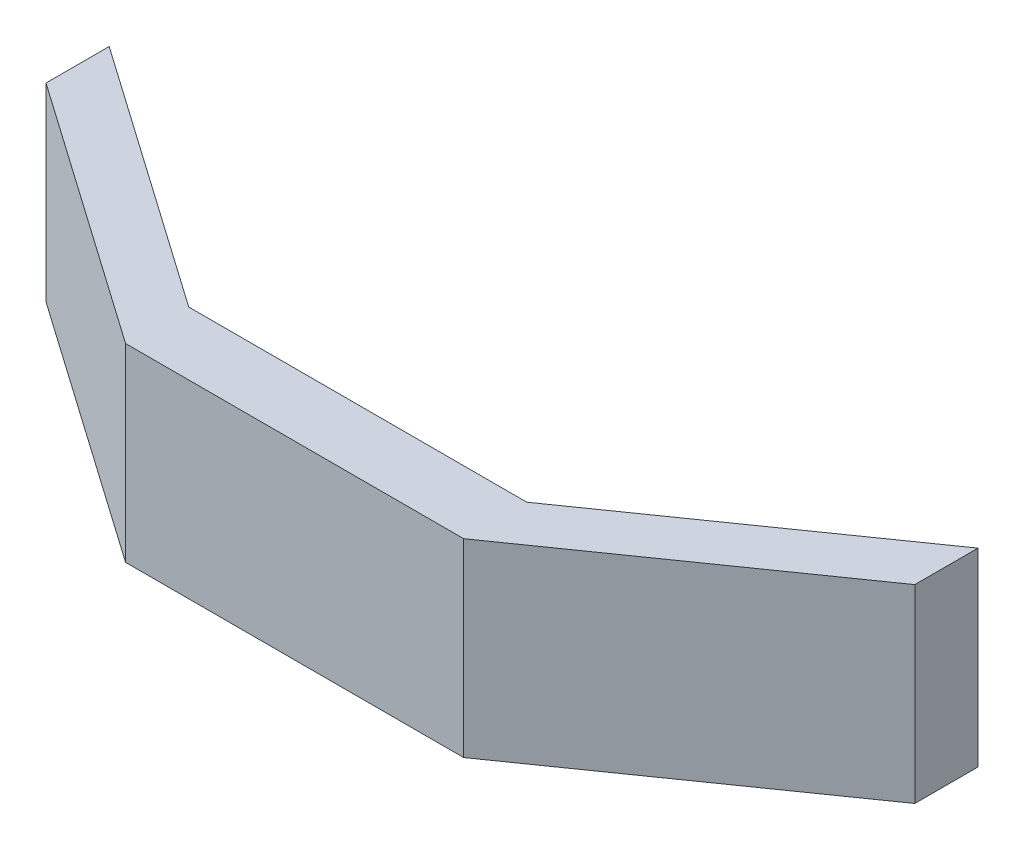
ISO-10303-21;
HEADER;
FILE_DESCRIPTION(('STEP AP214'),'2;1');
FILE_NAME('part.step','',(''),(''),'','','');
FILE_SCHEMA(('AUTOMOTIVE_DESIGN { 1 0 10303 214 1 1 1 1 }'));
ENDSEC;
DATA;
#1=APPLICATION_CONTEXT('core data for automotive mechanical design processes');
#2=APPLICATION_PROTOCOL_DEFINITION('international standard','automotive_design',2000,#1);
#3=PRODUCT_CONTEXT('',#1,'mechanical');
#4=PRODUCT('Part','Part','',(#3));
#5=PRODUCT_RELATED_PRODUCT_CATEGORY('part','',(#4));
#6=PRODUCT_DEFINITION_FORMATION('','',#4);
#7=PRODUCT_DEFINITION_CONTEXT('part definition',#1,'design');
#8=PRODUCT_DEFINITION('design','',#6,#7);
#9=PRODUCT_DEFINITION_SHAPE('','',#8);
#10=(LENGTH_UNIT() NAMED_UNIT(*) SI_UNIT(.MILLI.,.METRE.));
#11=(NAMED_UNIT(*) PLANE_ANGLE_UNIT() SI_UNIT($,.RADIAN.));
#12=(NAMED_UNIT(*) SI_UNIT($,.STERADIAN.) SOLID_ANGLE_UNIT());
#13=UNCERTAINTY_MEASURE_WITH_UNIT(LENGTH_MEASURE(1.E-05),#10,'distance_accuracy_value','');
#14=(GEOMETRIC_REPRESENTATION_CONTEXT(3) GLOBAL_UNCERTAINTY_ASSIGNED_CONTEXT((#13)) GLOBAL_UNIT_ASSIGNED_CONTEXT((#10,
#11,#12)) REPRESENTATION_CONTEXT('',''));
#15=CARTESIAN_POINT('',(0.,0.,0.));
#16=DIRECTION('',(0.,0.,1.));
#17=DIRECTION('',(1.,0.,0.));
#18=AXIS2_PLACEMENT_3D('',#15,#16,#17);
#19=CARTESIAN_POINT('',(53.5,60.,-10.));
#20=DIRECTION('',(0.573576436351042,0.,0.819152044288995));
#21=DIRECTION('',(0.819152044288995,0.,-0.573576436351042));
#22=AXIS2_PLACEMENT_3D('',#19,#20,#21);
#23=PLANE('',#22);
#24=DIRECTION('',(-0.819152044288995,0.,0.573576436351042));
#25=VECTOR('',#24,1.);
#26=CARTESIAN_POINT('',(53.5,0.,-10.));
#27=LINE('',#26,#25);
#28=CARTESIAN_POINT('',(137.496256044315,0.,-68.8148116636215));
#29=VERTEX_POINT('',#28);
#30=CARTESIAN_POINT('',(53.5,0.,-10.));
#31=VERTEX_POINT('',#30);
#32=EDGE_CURVE('E133',#29,#31,#27,.T.);
#33=ORIENTED_EDGE('',*,*,#32,.T.);
#34=DIRECTION('',(0.,-1.,0.));
#35=VECTOR('',#34,1.);
#36=CARTESIAN_POINT('',(53.5,60.,-10.));
#37=LINE('',#36,#35);
#38=CARTESIAN_POINT('',(53.5,60.,-10.));
#39=VERTEX_POINT('',#38);
#40=EDGE_CURVE('E11',#39,#31,#37,.T.);
#41=ORIENTED_EDGE('',*,*,#40,.F.);
#42=DIRECTION('',(-0.819152044288995,0.,0.573576436351042));
#43=VECTOR('',#42,1.);
#44=CARTESIAN_POINT('',(53.5,60.,-10.));
#45=LINE('',#44,#43);
#46=CARTESIAN_POINT('',(137.496256044315,60.,-68.8148116636215));
#47=VERTEX_POINT('',#46);
#48=EDGE_CURVE('E147',#47,#39,#45,.T.);
#49=ORIENTED_EDGE('',*,*,#48,.F.);
#50=DIRECTION('',(0.,-1.,0.));
#51=VECTOR('',#50,1.);
#52=CARTESIAN_POINT('',(137.496256044315,60.,-68.8148116636215));
#53=LINE('',#52,#51);
#54=EDGE_CURVE('E129',#47,#29,#53,.T.);
#55=ORIENTED_EDGE('',*,*,#54,.T.);
#56=EDGE_LOOP('',(#33,#41,#49,#55));
#57=FACE_BOUND('',#56,.T.);
#58=ADVANCED_FACE('F37',(#57),#23,.F.);
#59=CARTESIAN_POINT('',(-53.5,60.,-10.));
#60=DIRECTION('',(0.,0.,1.));
#61=DIRECTION('',(1.,0.,0.));
#62=AXIS2_PLACEMENT_3D('',#59,#60,#61);
#63=PLANE('',#62);
#64=DIRECTION('',(-1.,0.,0.));
#65=VECTOR('',#64,1.);
#66=CARTESIAN_POINT('',(-53.5,0.,-10.));
#67=LINE('',#66,#65);
#68=CARTESIAN_POINT('',(-53.5,0.,-10.));
#69=VERTEX_POINT('',#68);
#70=EDGE_CURVE('E136',#31,#69,#67,.T.);
#71=ORIENTED_EDGE('',*,*,#70,.T.);
#72=DIRECTION('',(0.,-1.,0.));
#73=VECTOR('',#72,1.);
#74=CARTESIAN_POINT('',(-53.5,60.,-10.));
#75=LINE('',#74,#73);
#76=CARTESIAN_POINT('',(-53.5,60.,-10.));
#77=VERTEX_POINT('',#76);
#78=EDGE_CURVE('E45',#77,#69,#75,.T.);
#79=ORIENTED_EDGE('',*,*,#78,.F.);
#80=DIRECTION('',(-1.,0.,0.));
#81=VECTOR('',#80,1.);
#82=CARTESIAN_POINT('',(-53.5,60.,-10.));
#83=LINE('',#82,#81);
#84=EDGE_CURVE('E96',#39,#77,#83,.T.);
#85=ORIENTED_EDGE('',*,*,#84,.F.);
#86=ORIENTED_EDGE('',*,*,#40,.T.);
#87=EDGE_LOOP('',(#71,#79,#85,#86));
#88=FACE_BOUND('',#87,.T.);
#89=ADVANCED_FACE('F182',(#88),#63,.F.);
#90=CARTESIAN_POINT('',(-53.5,60.,-10.));
#91=DIRECTION('',(-0.573576436351041,0.,0.819152044288995));
#92=DIRECTION('',(0.819152044288995,0.,0.573576436351041));
#93=AXIS2_PLACEMENT_3D('',#90,#91,#92);
#94=PLANE('',#93);
#95=DIRECTION('',(-0.819152044288995,0.,-0.573576436351041));
#96=VECTOR('',#95,1.);
#97=CARTESIAN_POINT('',(-53.5,0.,-10.));
#98=LINE('',#97,#96);
#99=CARTESIAN_POINT('',(-137.496256044315,0.,-68.8148116636215));
#100=VERTEX_POINT('',#99);
#101=EDGE_CURVE('E138',#69,#100,#98,.T.);
#102=ORIENTED_EDGE('',*,*,#101,.T.);
#103=DIRECTION('',(0.,-1.,0.));
#104=VECTOR('',#103,1.);
#105=CARTESIAN_POINT('',(-137.496256044315,60.,-68.8148116636215));
#106=LINE('',#105,#104);
#107=CARTESIAN_POINT('',(-137.496256044315,60.,-68.8148116636215));
#108=VERTEX_POINT('',#107);
#109=EDGE_CURVE('E154',#108,#100,#106,.T.);
#110=ORIENTED_EDGE('',*,*,#109,.F.);
#111=DIRECTION('',(-0.819152044288995,0.,-0.573576436351041));
#112=VECTOR('',#111,1.);
#113=CARTESIAN_POINT('',(-53.5,60.,-10.));
#114=LINE('',#113,#112);
#115=EDGE_CURVE('E162',#77,#108,#114,.T.);
#116=ORIENTED_EDGE('',*,*,#115,.F.);
#117=ORIENTED_EDGE('',*,*,#78,.T.);
#118=EDGE_LOOP('',(#102,#110,#116,#117));
#119=FACE_BOUND('',#118,.T.);
#120=ADVANCED_FACE('F160',(#119),#94,.F.);
#121=CARTESIAN_POINT('',(-137.496256044315,60.,-68.8148116636215));
#122=DIRECTION('',(1.,0.,0.));
#123=DIRECTION('',(0.,0.,-1.));
#124=AXIS2_PLACEMENT_3D('',#121,#122,#123);
#125=PLANE('',#124);
#126=DIRECTION('',(0.,0.,1.));
#127=VECTOR('',#126,1.);
#128=CARTESIAN_POINT('',(-137.496256044315,0.,-68.8148116636215));
#129=LINE('',#128,#127);
#130=CARTESIAN_POINT('',(-137.496256044315,0.,-48.8148116636214));
#131=VERTEX_POINT('',#130);
#132=EDGE_CURVE('E140',#100,#131,#129,.T.);
#133=ORIENTED_EDGE('',*,*,#132,.T.);
#134=DIRECTION('',(0.,-1.,0.));
#135=VECTOR('',#134,1.);
#136=CARTESIAN_POINT('',(-137.496256044315,60.,-48.8148116636214));
#137=LINE('',#136,#135);
#138=CARTESIAN_POINT('',(-137.496256044315,60.,-48.8148116636214));
#139=VERTEX_POINT('',#138);
#140=EDGE_CURVE('E151',#139,#131,#137,.T.);
#141=ORIENTED_EDGE('',*,*,#140,.F.);
#142=DIRECTION('',(0.,0.,1.));
#143=VECTOR('',#142,1.);
#144=CARTESIAN_POINT('',(-137.496256044315,60.,-68.8148116636215));
#145=LINE('',#144,#143);
#146=EDGE_CURVE('E174',#108,#139,#145,.T.);
#147=ORIENTED_EDGE('',*,*,#146,.F.);
#148=ORIENTED_EDGE('',*,*,#109,.T.);
#149=EDGE_LOOP('',(#133,#141,#147,#148));
#150=FACE_BOUND('',#149,.T.);
#151=ADVANCED_FACE('F170',(#150),#125,.F.);
#152=CARTESIAN_POINT('',(-137.496256044315,60.,-48.8148116636214));
#153=DIRECTION('',(0.573576436351041,0.,-0.819152044288995));
#154=DIRECTION('',(-0.819152044288995,0.,-0.573576436351041));
#155=AXIS2_PLACEMENT_3D('',#152,#153,#154);
#156=PLANE('',#155);
#157=DIRECTION('',(0.819152044288995,0.,0.573576436351041));
#158=VECTOR('',#157,1.);
#159=CARTESIAN_POINT('',(-137.496256044315,0.,-48.8148116636214));
#160=LINE('',#159,#158);
#161=CARTESIAN_POINT('',(-53.5,0.,10.));
#162=VERTEX_POINT('',#161);
#163=EDGE_CURVE('E142',#131,#162,#160,.T.);
#164=ORIENTED_EDGE('',*,*,#163,.T.);
#165=DIRECTION('',(0.,-1.,0.));
#166=VECTOR('',#165,1.);
#167=CARTESIAN_POINT('',(-53.5,60.,10.));
#168=LINE('',#167,#166);
#169=CARTESIAN_POINT('',(-53.5,60.,10.));
#170=VERTEX_POINT('',#169);
#171=EDGE_CURVE('E124',#170,#162,#168,.T.);
#172=ORIENTED_EDGE('',*,*,#171,.F.);
#173=DIRECTION('',(0.819152044288995,0.,0.573576436351041));
#174=VECTOR('',#173,1.);
#175=CARTESIAN_POINT('',(-137.496256044315,60.,-48.8148116636214));
#176=LINE('',#175,#174);
#177=EDGE_CURVE('E115',#139,#170,#176,.T.);
#178=ORIENTED_EDGE('',*,*,#177,.F.);
#179=ORIENTED_EDGE('',*,*,#140,.T.);
#180=EDGE_LOOP('',(#164,#172,#178,#179));
#181=FACE_BOUND('',#180,.T.);
#182=ADVANCED_FACE('F173',(#181),#156,.F.);
#183=CARTESIAN_POINT('',(-53.5,60.,10.));
#184=DIRECTION('',(0.,0.,-1.));
#185=DIRECTION('',(-1.,0.,0.));
#186=AXIS2_PLACEMENT_3D('',#183,#184,#185);
#187=PLANE('',#186);
#188=DIRECTION('',(1.,0.,0.));
#189=VECTOR('',#188,1.);
#190=CARTESIAN_POINT('',(-53.5,0.,10.));
#191=LINE('',#190,#189);
#192=CARTESIAN_POINT('',(53.5,0.,10.));
#193=VERTEX_POINT('',#192);
#194=EDGE_CURVE('E123',#162,#193,#191,.T.);
#195=ORIENTED_EDGE('',*,*,#194,.T.);
#196=DIRECTION('',(0.,-1.,0.));
#197=VECTOR('',#196,1.);
#198=CARTESIAN_POINT('',(53.5,60.,10.));
#199=LINE('',#198,#197);
#200=CARTESIAN_POINT('',(53.5,60.,10.));
#201=VERTEX_POINT('',#200);
#202=EDGE_CURVE('E120',#201,#193,#199,.T.);
#203=ORIENTED_EDGE('',*,*,#202,.F.);
#204=DIRECTION('',(1.,0.,0.));
#205=VECTOR('',#204,1.);
#206=CARTESIAN_POINT('',(-53.5,60.,10.));
#207=LINE('',#206,#205);
#208=EDGE_CURVE('E109',#170,#201,#207,.T.);
#209=ORIENTED_EDGE('',*,*,#208,.F.);
#210=ORIENTED_EDGE('',*,*,#171,.T.);
#211=EDGE_LOOP('',(#195,#203,#209,#210));
#212=FACE_BOUND('',#211,.T.);
#213=ADVANCED_FACE('F121',(#212),#187,.F.);
#214=CARTESIAN_POINT('',(137.496256044315,60.,-48.8148116636215));
#215=DIRECTION('',(-0.573576436351042,0.,-0.819152044288995));
#216=DIRECTION('',(-0.819152044288995,0.,0.573576436351042));
#217=AXIS2_PLACEMENT_3D('',#214,#215,#216);
#218=PLANE('',#217);
#219=DIRECTION('',(0.819152044288995,0.,-0.573576436351042));
#220=VECTOR('',#219,1.);
#221=CARTESIAN_POINT('',(137.496256044315,0.,-48.8148116636215));
#222=LINE('',#221,#220);
#223=CARTESIAN_POINT('',(137.496256044315,0.,-48.8148116636215));
#224=VERTEX_POINT('',#223);
#225=EDGE_CURVE('E82',#193,#224,#222,.T.);
#226=ORIENTED_EDGE('',*,*,#225,.T.);
#227=DIRECTION('',(0.,-1.,0.));
#228=VECTOR('',#227,1.);
#229=CARTESIAN_POINT('',(137.496256044315,60.,-48.8148116636215));
#230=LINE('',#229,#228);
#231=CARTESIAN_POINT('',(137.496256044315,60.,-48.8148116636215));
#232=VERTEX_POINT('',#231);
#233=EDGE_CURVE('E125',#232,#224,#230,.T.);
#234=ORIENTED_EDGE('',*,*,#233,.F.);
#235=DIRECTION('',(0.819152044288995,0.,-0.573576436351042));
#236=VECTOR('',#235,1.);
#237=CARTESIAN_POINT('',(137.496256044315,60.,-48.8148116636215));
#238=LINE('',#237,#236);
#239=EDGE_CURVE('E113',#201,#232,#238,.T.);
#240=ORIENTED_EDGE('',*,*,#239,.F.);
#241=ORIENTED_EDGE('',*,*,#202,.T.);
#242=EDGE_LOOP('',(#226,#234,#240,#241));
#243=FACE_BOUND('',#242,.T.);
#244=ADVANCED_FACE('F127',(#243),#218,.F.);
#245=CARTESIAN_POINT('',(137.496256044315,60.,-68.8148116636215));
#246=DIRECTION('',(-1.,0.,0.));
#247=DIRECTION('',(0.,0.,1.));
#248=AXIS2_PLACEMENT_3D('',#245,#246,#247);
#249=PLANE('',#248);
#250=DIRECTION('',(0.,0.,-1.));
#251=VECTOR('',#250,1.);
#252=CARTESIAN_POINT('',(137.496256044315,0.,-68.8148116636215));
#253=LINE('',#252,#251);
#254=EDGE_CURVE('E88',#224,#29,#253,.T.);
#255=ORIENTED_EDGE('',*,*,#254,.T.);
#256=ORIENTED_EDGE('',*,*,#54,.F.);
#257=DIRECTION('',(0.,0.,-1.));
#258=VECTOR('',#257,1.);
#259=CARTESIAN_POINT('',(137.496256044315,60.,-68.8148116636215));
#260=LINE('',#259,#258);
#261=EDGE_CURVE('E53',#232,#47,#260,.T.);
#262=ORIENTED_EDGE('',*,*,#261,.F.);
#263=ORIENTED_EDGE('',*,*,#233,.T.);
#264=EDGE_LOOP('',(#255,#256,#262,#263));
#265=FACE_BOUND('',#264,.T.);
#266=ADVANCED_FACE('F198',(#265),#249,.F.);
#267=CARTESIAN_POINT('',(0.,60.,0.));
#268=DIRECTION('',(0.,-1.,0.));
#269=DIRECTION('',(0.,0.,-1.));
#270=AXIS2_PLACEMENT_3D('',#267,#268,#269);
#271=PLANE('',#270);
#272=ORIENTED_EDGE('',*,*,#48,.T.);
#273=ORIENTED_EDGE('',*,*,#84,.T.);
#274=ORIENTED_EDGE('',*,*,#115,.T.);
#275=ORIENTED_EDGE('',*,*,#146,.T.);
#276=ORIENTED_EDGE('',*,*,#177,.T.);
#277=ORIENTED_EDGE('',*,*,#208,.T.);
#278=ORIENTED_EDGE('',*,*,#239,.T.);
#279=ORIENTED_EDGE('',*,*,#261,.T.);
#280=EDGE_LOOP('',(#272,#273,#274,#275,#276,#277,#278,#279));
#281=FACE_BOUND('',#280,.T.);
#282=ADVANCED_FACE('F111',(#281),#271,.F.);
#283=CARTESIAN_POINT('',(0.,0.,0.));
#284=DIRECTION('',(0.,-1.,0.));
#285=DIRECTION('',(0.,0.,-1.));
#286=AXIS2_PLACEMENT_3D('',#283,#284,#285);
#287=PLANE('',#286);
#288=ORIENTED_EDGE('',*,*,#32,.F.);
#289=ORIENTED_EDGE('',*,*,#254,.F.);
#290=ORIENTED_EDGE('',*,*,#225,.F.);
#291=ORIENTED_EDGE('',*,*,#194,.F.);
#292=ORIENTED_EDGE('',*,*,#163,.F.);
#293=ORIENTED_EDGE('',*,*,#132,.F.);
#294=ORIENTED_EDGE('',*,*,#101,.F.);
#295=ORIENTED_EDGE('',*,*,#70,.F.);
#296=EDGE_LOOP('',(#288,#289,#290,#291,#292,#293,#294,#295));
#297=FACE_BOUND('',#296,.T.);
#298=ADVANCED_FACE('F166',(#297),#287,.T.);
#299=CLOSED_SHELL('',(#58,#89,#120,#151,#182,#213,#244,#266,#282,#298));
#300=MANIFOLD_SOLID_BREP('B2',#299);
#301=ADVANCED_BREP_SHAPE_REPRESENTATION('',(#18,#300),#14);
#302=SHAPE_DEFINITION_REPRESENTATION(#9,#301);
ENDSEC;
END-ISO-10303-21;
